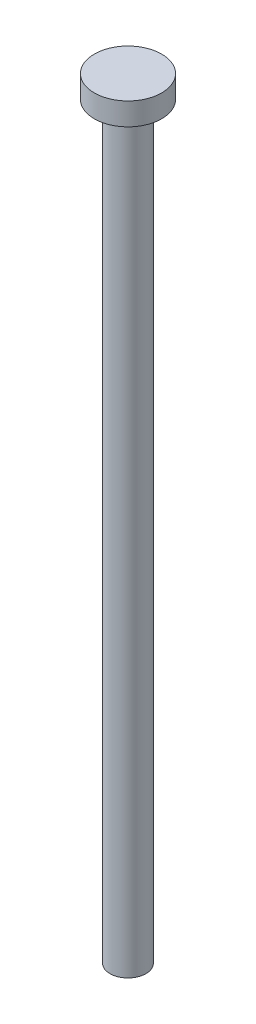
ISO-10303-21;
HEADER;
FILE_DESCRIPTION(('STEP AP214'),'2;1');
FILE_NAME('part.step','',(''),(''),'','','');
FILE_SCHEMA(('AUTOMOTIVE_DESIGN { 1 0 10303 214 1 1 1 1 }'));
ENDSEC;
DATA;
#1=APPLICATION_CONTEXT('core data for automotive mechanical design processes');
#2=APPLICATION_PROTOCOL_DEFINITION('international standard','automotive_design',2000,#1);
#3=PRODUCT_CONTEXT('',#1,'mechanical');
#4=PRODUCT('Part','Part','',(#3));
#5=PRODUCT_RELATED_PRODUCT_CATEGORY('part','',(#4));
#6=PRODUCT_DEFINITION_FORMATION('','',#4);
#7=PRODUCT_DEFINITION_CONTEXT('part definition',#1,'design');
#8=PRODUCT_DEFINITION('design','',#6,#7);
#9=PRODUCT_DEFINITION_SHAPE('','',#8);
#10=(LENGTH_UNIT() NAMED_UNIT(*) SI_UNIT(.MILLI.,.METRE.));
#11=(NAMED_UNIT(*) PLANE_ANGLE_UNIT() SI_UNIT($,.RADIAN.));
#12=(NAMED_UNIT(*) SI_UNIT($,.STERADIAN.) SOLID_ANGLE_UNIT());
#13=UNCERTAINTY_MEASURE_WITH_UNIT(LENGTH_MEASURE(1.E-05),#10,'distance_accuracy_value','');
#14=(GEOMETRIC_REPRESENTATION_CONTEXT(3) GLOBAL_UNCERTAINTY_ASSIGNED_CONTEXT((#13)) GLOBAL_UNIT_ASSIGNED_CONTEXT((#10,
#11,#12)) REPRESENTATION_CONTEXT('',''));
#15=CARTESIAN_POINT('',(0.,0.,0.));
#16=DIRECTION('',(0.,0.,1.));
#17=DIRECTION('',(1.,0.,0.));
#18=AXIS2_PLACEMENT_3D('',#15,#16,#17);
#19=CARTESIAN_POINT('',(0.,50.,0.));
#20=DIRECTION('',(0.,-1.,0.));
#21=DIRECTION('',(0.,0.,-1.));
#22=AXIS2_PLACEMENT_3D('',#19,#20,#21);
#23=CYLINDRICAL_SURFACE('',#22,2.4);
#24=CARTESIAN_POINT('',(0.,50.,0.));
#25=DIRECTION('',(0.,1.,0.));
#26=DIRECTION('',(0.,0.,1.));
#27=AXIS2_PLACEMENT_3D('',#24,#25,#26);
#28=CIRCLE('',#27,2.4);
#29=CARTESIAN_POINT('',(0.,50.,2.4));
#30=VERTEX_POINT('',#29);
#31=EDGE_CURVE('E10',#30,#30,#28,.T.);
#32=ORIENTED_EDGE('',*,*,#31,.F.);
#33=EDGE_LOOP('',(#32));
#34=FACE_BOUND('',#33,.T.);
#35=CARTESIAN_POINT('',(0.,-50.,0.));
#36=DIRECTION('',(0.,1.,0.));
#37=DIRECTION('',(0.,0.,1.));
#38=AXIS2_PLACEMENT_3D('',#35,#36,#37);
#39=CIRCLE('',#38,2.4);
#40=CARTESIAN_POINT('',(0.,-50.,2.4));
#41=VERTEX_POINT('',#40);
#42=EDGE_CURVE('E40',#41,#41,#39,.T.);
#43=ORIENTED_EDGE('',*,*,#42,.T.);
#44=EDGE_LOOP('',(#43));
#45=FACE_BOUND('',#44,.T.);
#46=ADVANCED_FACE('F37',(#34,#45),#23,.T.);
#47=CARTESIAN_POINT('',(0.,-50.,0.));
#48=DIRECTION('',(0.,1.,0.));
#49=DIRECTION('',(0.,0.,1.));
#50=AXIS2_PLACEMENT_3D('',#47,#48,#49);
#51=PLANE('',#50);
#52=ORIENTED_EDGE('',*,*,#42,.F.);
#53=EDGE_LOOP('',(#52));
#54=FACE_BOUND('',#53,.T.);
#55=ADVANCED_FACE('F60',(#54),#51,.F.);
#56=CARTESIAN_POINT('',(0.,53.,0.));
#57=DIRECTION('',(0.,-1.,0.));
#58=DIRECTION('',(0.,0.,-1.));
#59=AXIS2_PLACEMENT_3D('',#56,#57,#58);
#60=CYLINDRICAL_SURFACE('',#59,4.5);
#61=CARTESIAN_POINT('',(0.,53.,0.));
#62=DIRECTION('',(0.,1.,0.));
#63=DIRECTION('',(0.,0.,1.));
#64=AXIS2_PLACEMENT_3D('',#61,#62,#63);
#65=CIRCLE('',#64,4.5);
#66=CARTESIAN_POINT('',(0.,53.,4.5));
#67=VERTEX_POINT('',#66);
#68=EDGE_CURVE('E47',#67,#67,#65,.T.);
#69=ORIENTED_EDGE('',*,*,#68,.F.);
#70=EDGE_LOOP('',(#69));
#71=FACE_BOUND('',#70,.T.);
#72=CARTESIAN_POINT('',(0.,50.,0.));
#73=DIRECTION('',(0.,1.,0.));
#74=DIRECTION('',(0.,0.,1.));
#75=AXIS2_PLACEMENT_3D('',#72,#73,#74);
#76=CIRCLE('',#75,4.5);
#77=CARTESIAN_POINT('',(0.,50.,4.5));
#78=VERTEX_POINT('',#77);
#79=EDGE_CURVE('E49',#78,#78,#76,.T.);
#80=ORIENTED_EDGE('',*,*,#79,.T.);
#81=EDGE_LOOP('',(#80));
#82=FACE_BOUND('',#81,.T.);
#83=ADVANCED_FACE('F57',(#71,#82),#60,.T.);
#84=CARTESIAN_POINT('',(0.,53.,0.));
#85=DIRECTION('',(0.,1.,0.));
#86=DIRECTION('',(0.,0.,1.));
#87=AXIS2_PLACEMENT_3D('',#84,#85,#86);
#88=PLANE('',#87);
#89=ORIENTED_EDGE('',*,*,#68,.T.);
#90=EDGE_LOOP('',(#89));
#91=FACE_BOUND('',#90,.T.);
#92=ADVANCED_FACE('F55',(#91),#88,.T.);
#93=CARTESIAN_POINT('',(0.,50.,0.));
#94=DIRECTION('',(0.,1.,0.));
#95=DIRECTION('',(0.,0.,1.));
#96=AXIS2_PLACEMENT_3D('',#93,#94,#95);
#97=PLANE('',#96);
#98=ORIENTED_EDGE('',*,*,#31,.T.);
#99=EDGE_LOOP('',(#98));
#100=FACE_BOUND('',#99,.T.);
#101=ORIENTED_EDGE('',*,*,#79,.F.);
#102=EDGE_LOOP('',(#101));
#103=FACE_BOUND('',#102,.T.);
#104=ADVANCED_FACE('F64',(#100,#103),#97,.F.);
#105=CLOSED_SHELL('',(#46,#55,#83,#92,#104));
#106=MANIFOLD_SOLID_BREP('B2',#105);
#107=ADVANCED_BREP_SHAPE_REPRESENTATION('',(#18,#106),#14);
#108=SHAPE_DEFINITION_REPRESENTATION(#9,#107);
ENDSEC;
END-ISO-10303-21;
